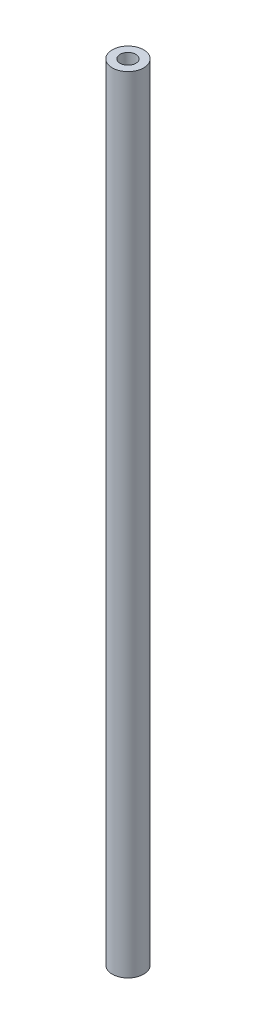
ISO-10303-21;
HEADER;
FILE_DESCRIPTION(('STEP AP214'),'2;1');
FILE_NAME('part.step','',(''),(''),'','','');
FILE_SCHEMA(('AUTOMOTIVE_DESIGN { 1 0 10303 214 1 1 1 1 }'));
ENDSEC;
DATA;
#1=APPLICATION_CONTEXT('core data for automotive mechanical design processes');
#2=APPLICATION_PROTOCOL_DEFINITION('international standard','automotive_design',2000,#1);
#3=PRODUCT_CONTEXT('',#1,'mechanical');
#4=PRODUCT('Part','Part','',(#3));
#5=PRODUCT_RELATED_PRODUCT_CATEGORY('part','',(#4));
#6=PRODUCT_DEFINITION_FORMATION('','',#4);
#7=PRODUCT_DEFINITION_CONTEXT('part definition',#1,'design');
#8=PRODUCT_DEFINITION('design','',#6,#7);
#9=PRODUCT_DEFINITION_SHAPE('','',#8);
#10=(LENGTH_UNIT() NAMED_UNIT(*) SI_UNIT(.MILLI.,.METRE.));
#11=(NAMED_UNIT(*) PLANE_ANGLE_UNIT() SI_UNIT($,.RADIAN.));
#12=(NAMED_UNIT(*) SI_UNIT($,.STERADIAN.) SOLID_ANGLE_UNIT());
#13=UNCERTAINTY_MEASURE_WITH_UNIT(LENGTH_MEASURE(1.E-05),#10,'distance_accuracy_value','');
#14=(GEOMETRIC_REPRESENTATION_CONTEXT(3) GLOBAL_UNCERTAINTY_ASSIGNED_CONTEXT((#13)) GLOBAL_UNIT_ASSIGNED_CONTEXT((#10,
#11,#12)) REPRESENTATION_CONTEXT('',''));
#15=CARTESIAN_POINT('',(0.,0.,0.));
#16=DIRECTION('',(0.,0.,1.));
#17=DIRECTION('',(1.,0.,0.));
#18=AXIS2_PLACEMENT_3D('',#15,#16,#17);
#19=CARTESIAN_POINT('',(0.,200.,0.));
#20=DIRECTION('',(0.,1.,0.));
#21=DIRECTION('',(0.,0.,1.));
#22=AXIS2_PLACEMENT_3D('',#19,#20,#21);
#23=PLANE('',#22);
#24=CARTESIAN_POINT('',(0.,200.,0.));
#25=DIRECTION('',(0.,1.,0.));
#26=DIRECTION('',(0.,0.,1.));
#27=AXIS2_PLACEMENT_3D('',#24,#25,#26);
#28=CIRCLE('',#27,4.);
#29=CARTESIAN_POINT('',(0.,200.,4.));
#30=VERTEX_POINT('',#29);
#31=EDGE_CURVE('E10',#30,#30,#28,.T.);
#32=ORIENTED_EDGE('',*,*,#31,.T.);
#33=EDGE_LOOP('',(#32));
#34=FACE_BOUND('',#33,.T.);
#35=CARTESIAN_POINT('',(0.,200.,0.));
#36=DIRECTION('',(0.,1.,0.));
#37=DIRECTION('',(0.,0.,1.));
#38=AXIS2_PLACEMENT_3D('',#35,#36,#37);
#39=CIRCLE('',#38,2.);
#40=CARTESIAN_POINT('',(0.,200.,2.));
#41=VERTEX_POINT('',#40);
#42=EDGE_CURVE('E48',#41,#41,#39,.T.);
#43=ORIENTED_EDGE('',*,*,#42,.F.);
#44=EDGE_LOOP('',(#43));
#45=FACE_BOUND('',#44,.T.);
#46=ADVANCED_FACE('F37',(#34,#45),#23,.T.);
#47=CARTESIAN_POINT('',(0.,0.,0.));
#48=DIRECTION('',(0.,1.,0.));
#49=DIRECTION('',(0.,0.,1.));
#50=AXIS2_PLACEMENT_3D('',#47,#48,#49);
#51=PLANE('',#50);
#52=CARTESIAN_POINT('',(0.,0.,0.));
#53=DIRECTION('',(0.,1.,0.));
#54=DIRECTION('',(0.,0.,1.));
#55=AXIS2_PLACEMENT_3D('',#52,#53,#54);
#56=CIRCLE('',#55,4.);
#57=CARTESIAN_POINT('',(0.,0.,4.));
#58=VERTEX_POINT('',#57);
#59=EDGE_CURVE('E41',#58,#58,#56,.T.);
#60=ORIENTED_EDGE('',*,*,#59,.F.);
#61=EDGE_LOOP('',(#60));
#62=FACE_BOUND('',#61,.T.);
#63=CARTESIAN_POINT('',(0.,0.,0.));
#64=DIRECTION('',(0.,1.,0.));
#65=DIRECTION('',(0.,0.,1.));
#66=AXIS2_PLACEMENT_3D('',#63,#64,#65);
#67=CIRCLE('',#66,2.);
#68=CARTESIAN_POINT('',(0.,0.,2.));
#69=VERTEX_POINT('',#68);
#70=EDGE_CURVE('E50',#69,#69,#67,.T.);
#71=ORIENTED_EDGE('',*,*,#70,.T.);
#72=EDGE_LOOP('',(#71));
#73=FACE_BOUND('',#72,.T.);
#74=ADVANCED_FACE('F60',(#62,#73),#51,.F.);
#75=CARTESIAN_POINT('',(0.,200.,0.));
#76=DIRECTION('',(0.,-1.,0.));
#77=DIRECTION('',(0.,0.,-1.));
#78=AXIS2_PLACEMENT_3D('',#75,#76,#77);
#79=CYLINDRICAL_SURFACE('',#78,4.);
#80=ORIENTED_EDGE('',*,*,#31,.F.);
#81=EDGE_LOOP('',(#80));
#82=FACE_BOUND('',#81,.T.);
#83=ORIENTED_EDGE('',*,*,#59,.T.);
#84=EDGE_LOOP('',(#83));
#85=FACE_BOUND('',#84,.T.);
#86=ADVANCED_FACE('F39',(#82,#85),#79,.T.);
#87=CARTESIAN_POINT('',(0.,200.,0.));
#88=DIRECTION('',(0.,-1.,0.));
#89=DIRECTION('',(0.,0.,-1.));
#90=AXIS2_PLACEMENT_3D('',#87,#88,#89);
#91=CYLINDRICAL_SURFACE('',#90,2.);
#92=ORIENTED_EDGE('',*,*,#42,.T.);
#93=EDGE_LOOP('',(#92));
#94=FACE_BOUND('',#93,.T.);
#95=ORIENTED_EDGE('',*,*,#70,.F.);
#96=EDGE_LOOP('',(#95));
#97=FACE_BOUND('',#96,.T.);
#98=ADVANCED_FACE('F56',(#94,#97),#91,.F.);
#99=CLOSED_SHELL('',(#46,#74,#86,#98));
#100=MANIFOLD_SOLID_BREP('B2',#99);
#101=ADVANCED_BREP_SHAPE_REPRESENTATION('',(#18,#100),#14);
#102=SHAPE_DEFINITION_REPRESENTATION(#9,#101);
ENDSEC;
END-ISO-10303-21;
